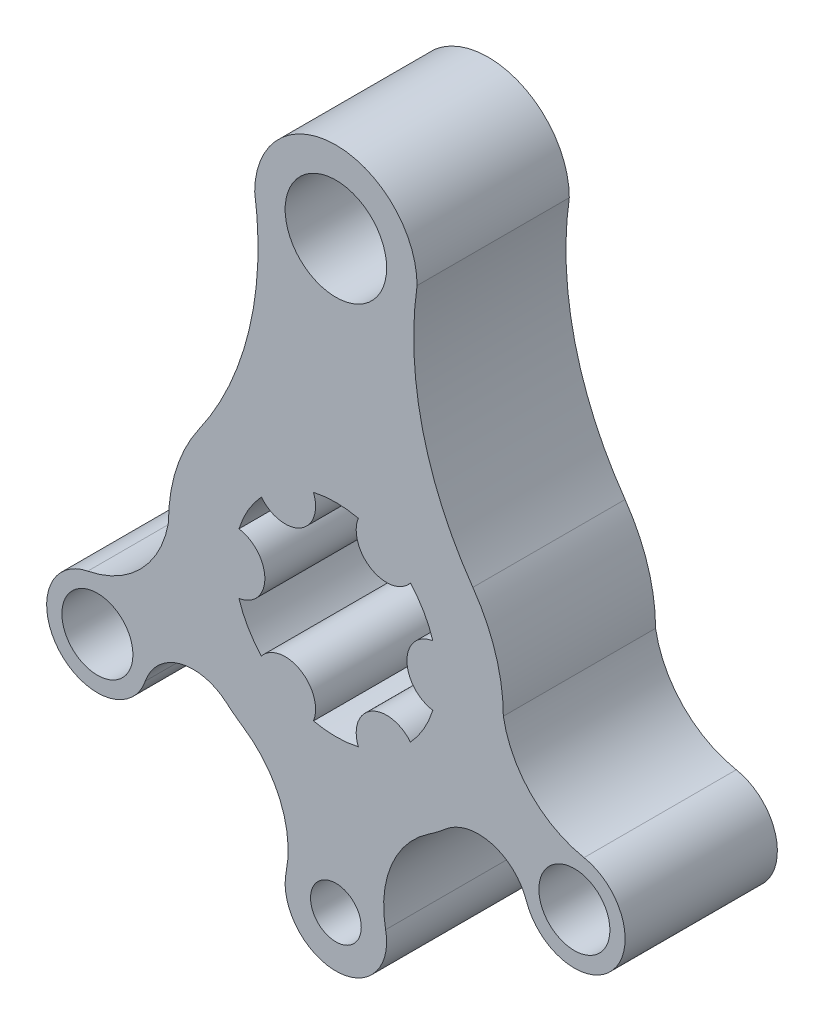
ISO-10303-21;
HEADER;
FILE_DESCRIPTION(('STEP AP214'),'2;1');
FILE_NAME('part.step','',(''),(''),'','','');
FILE_SCHEMA(('AUTOMOTIVE_DESIGN { 1 0 10303 214 1 1 1 1 }'));
ENDSEC;
DATA;
#1=APPLICATION_CONTEXT('core data for automotive mechanical design processes');
#2=APPLICATION_PROTOCOL_DEFINITION('international standard','automotive_design',2000,#1);
#3=PRODUCT_CONTEXT('',#1,'mechanical');
#4=PRODUCT('Part','Part','',(#3));
#5=PRODUCT_RELATED_PRODUCT_CATEGORY('part','',(#4));
#6=PRODUCT_DEFINITION_FORMATION('','',#4);
#7=PRODUCT_DEFINITION_CONTEXT('part definition',#1,'design');
#8=PRODUCT_DEFINITION('design','',#6,#7);
#9=PRODUCT_DEFINITION_SHAPE('','',#8);
#10=(LENGTH_UNIT() NAMED_UNIT(*) SI_UNIT(.MILLI.,.METRE.));
#11=(NAMED_UNIT(*) PLANE_ANGLE_UNIT() SI_UNIT($,.RADIAN.));
#12=(NAMED_UNIT(*) SI_UNIT($,.STERADIAN.) SOLID_ANGLE_UNIT());
#13=UNCERTAINTY_MEASURE_WITH_UNIT(LENGTH_MEASURE(1.E-05),#10,'distance_accuracy_value','');
#14=(GEOMETRIC_REPRESENTATION_CONTEXT(3) GLOBAL_UNCERTAINTY_ASSIGNED_CONTEXT((#13)) GLOBAL_UNIT_ASSIGNED_CONTEXT((#10,
#11,#12)) REPRESENTATION_CONTEXT('',''));
#15=CARTESIAN_POINT('',(0.,0.,0.));
#16=DIRECTION('',(0.,0.,1.));
#17=DIRECTION('',(1.,0.,0.));
#18=AXIS2_PLACEMENT_3D('',#15,#16,#17);
#19=CARTESIAN_POINT('',(52.6995581234815,3.4536082203362,15.));
#20=DIRECTION('',(0.,0.,-1.));
#21=DIRECTION('',(-1.,0.,0.));
#22=AXIS2_PLACEMENT_3D('',#19,#20,#21);
#23=CYLINDRICAL_SURFACE('',#22,20.);
#24=CARTESIAN_POINT('',(52.6995581234815,3.4536082203362,-15.));
#25=DIRECTION('',(0.,0.,1.));
#26=DIRECTION('',(1.,0.,0.));
#27=AXIS2_PLACEMENT_3D('',#24,#25,#26);
#28=CIRCLE('',#27,20.);
#29=CARTESIAN_POINT('',(33.,0.,-15.));
#30=VERTEX_POINT('',#29);
#31=CARTESIAN_POINT('',(48.8998527078272,-16.1821305932213,-15.));
#32=VERTEX_POINT('',#31);
#33=EDGE_CURVE('E305',#30,#32,#28,.T.);
#34=ORIENTED_EDGE('',*,*,#33,.F.);
#35=DIRECTION('',(0.,0.,-1.));
#36=VECTOR('',#35,1.);
#37=CARTESIAN_POINT('',(33.,0.,15.));
#38=LINE('',#37,#36);
#39=CARTESIAN_POINT('',(33.,0.,15.));
#40=VERTEX_POINT('',#39);
#41=EDGE_CURVE('E11',#40,#30,#38,.T.);
#42=ORIENTED_EDGE('',*,*,#41,.F.);
#43=CARTESIAN_POINT('',(52.6995581234815,3.4536082203362,15.));
#44=DIRECTION('',(0.,0.,1.));
#45=DIRECTION('',(1.,0.,0.));
#46=AXIS2_PLACEMENT_3D('',#43,#44,#45);
#47=CIRCLE('',#46,20.);
#48=CARTESIAN_POINT('',(48.8998527078272,-16.1821305932213,15.));
#49=VERTEX_POINT('',#48);
#50=EDGE_CURVE('E486',#40,#49,#47,.T.);
#51=ORIENTED_EDGE('',*,*,#50,.T.);
#52=DIRECTION('',(0.,0.,-1.));
#53=VECTOR('',#52,1.);
#54=CARTESIAN_POINT('',(48.8998527078272,-16.1821305932213,15.));
#55=LINE('',#54,#53);
#56=EDGE_CURVE('E150',#49,#32,#55,.T.);
#57=ORIENTED_EDGE('',*,*,#56,.T.);
#58=EDGE_LOOP('',(#34,#42,#51,#57));
#59=FACE_BOUND('',#58,.T.);
#60=ADVANCED_FACE('F37',(#59),#23,.F.);
#61=CARTESIAN_POINT('',(0.,0.,15.));
#62=DIRECTION('',(0.,0.,-1.));
#63=DIRECTION('',(-1.,0.,0.));
#64=AXIS2_PLACEMENT_3D('',#61,#62,#63);
#65=CYLINDRICAL_SURFACE('',#64,33.);
#66=CARTESIAN_POINT('',(0.,0.,-15.));
#67=DIRECTION('',(0.,0.,1.));
#68=DIRECTION('',(1.,0.,0.));
#69=AXIS2_PLACEMENT_3D('',#66,#67,#68);
#70=CIRCLE('',#69,33.);
#71=CARTESIAN_POINT('',(26.9908252272568,18.9867151859314,-15.));
#72=VERTEX_POINT('',#71);
#73=EDGE_CURVE('E308',#30,#72,#70,.T.);
#74=ORIENTED_EDGE('',*,*,#73,.T.);
#75=DIRECTION('',(0.,0.,-1.));
#76=VECTOR('',#75,1.);
#77=CARTESIAN_POINT('',(26.9908252272568,18.9867151859314,15.));
#78=LINE('',#77,#76);
#79=CARTESIAN_POINT('',(26.9908252272568,18.9867151859314,15.));
#80=VERTEX_POINT('',#79);
#81=EDGE_CURVE('E47',#80,#72,#78,.T.);
#82=ORIENTED_EDGE('',*,*,#81,.F.);
#83=CARTESIAN_POINT('',(0.,0.,15.));
#84=DIRECTION('',(0.,0.,1.));
#85=DIRECTION('',(1.,0.,0.));
#86=AXIS2_PLACEMENT_3D('',#83,#84,#85);
#87=CIRCLE('',#86,33.);
#88=EDGE_CURVE('E488',#40,#80,#87,.T.);
#89=ORIENTED_EDGE('',*,*,#88,.F.);
#90=ORIENTED_EDGE('',*,*,#41,.T.);
#91=EDGE_LOOP('',(#74,#82,#89,#90));
#92=FACE_BOUND('',#91,.T.);
#93=ADVANCED_FACE('F528',(#92),#65,.T.);
#94=CARTESIAN_POINT('',(79.3366680922397,55.8094355465256,15.));
#95=DIRECTION('',(0.,0.,-1.));
#96=DIRECTION('',(-1.,0.,0.));
#97=AXIS2_PLACEMENT_3D('',#94,#95,#96);
#98=CYLINDRICAL_SURFACE('',#97,64.);
#99=CARTESIAN_POINT('',(79.3366680922397,55.8094355465256,-15.));
#100=DIRECTION('',(0.,0.,1.));
#101=DIRECTION('',(1.,0.,0.));
#102=AXIS2_PLACEMENT_3D('',#99,#100,#101);
#103=CIRCLE('',#102,64.);
#104=CARTESIAN_POINT('',(16.,65.0000000000001,-15.));
#105=VERTEX_POINT('',#104);
#106=EDGE_CURVE('E311',#105,#72,#103,.T.);
#107=ORIENTED_EDGE('',*,*,#106,.F.);
#108=DIRECTION('',(0.,0.,-1.));
#109=VECTOR('',#108,1.);
#110=CARTESIAN_POINT('',(16.,65.0000000000001,15.));
#111=LINE('',#110,#109);
#112=CARTESIAN_POINT('',(16.,65.0000000000001,15.));
#113=VERTEX_POINT('',#112);
#114=EDGE_CURVE('E379',#113,#105,#111,.T.);
#115=ORIENTED_EDGE('',*,*,#114,.F.);
#116=CARTESIAN_POINT('',(79.3366680922397,55.8094355465256,15.));
#117=DIRECTION('',(0.,0.,1.));
#118=DIRECTION('',(1.,0.,0.));
#119=AXIS2_PLACEMENT_3D('',#116,#117,#118);
#120=CIRCLE('',#119,64.);
#121=EDGE_CURVE('E490',#113,#80,#120,.T.);
#122=ORIENTED_EDGE('',*,*,#121,.T.);
#123=ORIENTED_EDGE('',*,*,#81,.T.);
#124=EDGE_LOOP('',(#107,#115,#122,#123));
#125=FACE_BOUND('',#124,.T.);
#126=ADVANCED_FACE('F531',(#125),#98,.F.);
#127=CARTESIAN_POINT('',(0.,65.,15.));
#128=DIRECTION('',(0.,0.,-1.));
#129=DIRECTION('',(-1.,0.,0.));
#130=AXIS2_PLACEMENT_3D('',#127,#128,#129);
#131=CYLINDRICAL_SURFACE('',#130,16.);
#132=CARTESIAN_POINT('',(0.,65.,-15.));
#133=DIRECTION('',(0.,0.,1.));
#134=DIRECTION('',(1.,0.,0.));
#135=AXIS2_PLACEMENT_3D('',#132,#133,#134);
#136=CIRCLE('',#135,16.);
#137=CARTESIAN_POINT('',(-16.,65.0000000000001,-15.));
#138=VERTEX_POINT('',#137);
#139=EDGE_CURVE('E314',#105,#138,#136,.T.);
#140=ORIENTED_EDGE('',*,*,#139,.T.);
#141=DIRECTION('',(0.,0.,-1.));
#142=VECTOR('',#141,1.);
#143=CARTESIAN_POINT('',(-16.,65.0000000000001,15.));
#144=LINE('',#143,#142);
#145=CARTESIAN_POINT('',(-16.,65.0000000000001,15.));
#146=VERTEX_POINT('',#145);
#147=EDGE_CURVE('E376',#146,#138,#144,.T.);
#148=ORIENTED_EDGE('',*,*,#147,.F.);
#149=CARTESIAN_POINT('',(0.,65.,15.));
#150=DIRECTION('',(0.,0.,1.));
#151=DIRECTION('',(1.,0.,0.));
#152=AXIS2_PLACEMENT_3D('',#149,#150,#151);
#153=CIRCLE('',#152,16.);
#154=EDGE_CURVE('E493',#113,#146,#153,.T.);
#155=ORIENTED_EDGE('',*,*,#154,.F.);
#156=ORIENTED_EDGE('',*,*,#114,.T.);
#157=EDGE_LOOP('',(#140,#148,#155,#156));
#158=FACE_BOUND('',#157,.T.);
#159=ADVANCED_FACE('F536',(#158),#131,.T.);
#160=CARTESIAN_POINT('',(-79.3366680922397,55.8094355465256,15.));
#161=DIRECTION('',(0.,0.,-1.));
#162=DIRECTION('',(-1.,0.,0.));
#163=AXIS2_PLACEMENT_3D('',#160,#161,#162);
#164=CYLINDRICAL_SURFACE('',#163,64.);
#165=CARTESIAN_POINT('',(-79.3366680922397,55.8094355465256,-15.));
#166=DIRECTION('',(0.,0.,1.));
#167=DIRECTION('',(1.,0.,0.));
#168=AXIS2_PLACEMENT_3D('',#165,#166,#167);
#169=CIRCLE('',#168,64.);
#170=CARTESIAN_POINT('',(-26.9908252272568,18.9867151859314,-15.));
#171=VERTEX_POINT('',#170);
#172=EDGE_CURVE('E317',#138,#171,#169,.F.);
#173=ORIENTED_EDGE('',*,*,#172,.T.);
#174=DIRECTION('',(0.,0.,-1.));
#175=VECTOR('',#174,1.);
#176=CARTESIAN_POINT('',(-26.9908252272568,18.9867151859314,15.));
#177=LINE('',#176,#175);
#178=CARTESIAN_POINT('',(-26.9908252272568,18.9867151859314,15.));
#179=VERTEX_POINT('',#178);
#180=EDGE_CURVE('E373',#179,#171,#177,.T.);
#181=ORIENTED_EDGE('',*,*,#180,.F.);
#182=CARTESIAN_POINT('',(-79.3366680922397,55.8094355465256,15.));
#183=DIRECTION('',(0.,0.,1.));
#184=DIRECTION('',(1.,0.,0.));
#185=AXIS2_PLACEMENT_3D('',#182,#183,#184);
#186=CIRCLE('',#185,64.);
#187=EDGE_CURVE('E496',#146,#179,#186,.F.);
#188=ORIENTED_EDGE('',*,*,#187,.F.);
#189=ORIENTED_EDGE('',*,*,#147,.T.);
#190=EDGE_LOOP('',(#173,#181,#188,#189));
#191=FACE_BOUND('',#190,.T.);
#192=ADVANCED_FACE('F540',(#191),#164,.F.);
#193=CARTESIAN_POINT('',(0.,0.,15.));
#194=DIRECTION('',(0.,0.,-1.));
#195=DIRECTION('',(-1.,0.,0.));
#196=AXIS2_PLACEMENT_3D('',#193,#194,#195);
#197=CYLINDRICAL_SURFACE('',#196,33.);
#198=CARTESIAN_POINT('',(0.,0.,-15.));
#199=DIRECTION('',(0.,0.,1.));
#200=DIRECTION('',(1.,0.,0.));
#201=AXIS2_PLACEMENT_3D('',#198,#199,#200);
#202=CIRCLE('',#201,33.);
#203=CARTESIAN_POINT('',(-33.,0.,-15.));
#204=VERTEX_POINT('',#203);
#205=EDGE_CURVE('E320',#171,#204,#202,.T.);
#206=ORIENTED_EDGE('',*,*,#205,.T.);
#207=DIRECTION('',(0.,0.,-1.));
#208=VECTOR('',#207,1.);
#209=CARTESIAN_POINT('',(-33.,0.,15.));
#210=LINE('',#209,#208);
#211=CARTESIAN_POINT('',(-33.,0.,15.));
#212=VERTEX_POINT('',#211);
#213=EDGE_CURVE('E370',#212,#204,#210,.T.);
#214=ORIENTED_EDGE('',*,*,#213,.F.);
#215=CARTESIAN_POINT('',(0.,0.,15.));
#216=DIRECTION('',(0.,0.,1.));
#217=DIRECTION('',(1.,0.,0.));
#218=AXIS2_PLACEMENT_3D('',#215,#216,#217);
#219=CIRCLE('',#218,33.);
#220=EDGE_CURVE('E499',#179,#212,#219,.T.);
#221=ORIENTED_EDGE('',*,*,#220,.F.);
#222=ORIENTED_EDGE('',*,*,#180,.T.);
#223=EDGE_LOOP('',(#206,#214,#221,#222));
#224=FACE_BOUND('',#223,.T.);
#225=ADVANCED_FACE('F542',(#224),#197,.T.);
#226=CARTESIAN_POINT('',(-52.6995581234815,3.4536082203362,15.));
#227=DIRECTION('',(0.,0.,-1.));
#228=DIRECTION('',(-1.,0.,0.));
#229=AXIS2_PLACEMENT_3D('',#226,#227,#228);
#230=CYLINDRICAL_SURFACE('',#229,20.);
#231=CARTESIAN_POINT('',(-52.6995581234815,3.4536082203362,-15.));
#232=DIRECTION('',(0.,0.,1.));
#233=DIRECTION('',(1.,0.,0.));
#234=AXIS2_PLACEMENT_3D('',#231,#232,#233);
#235=CIRCLE('',#234,20.);
#236=CARTESIAN_POINT('',(-48.8998527078272,-16.1821305932213,-15.));
#237=VERTEX_POINT('',#236);
#238=EDGE_CURVE('E323',#204,#237,#235,.F.);
#239=ORIENTED_EDGE('',*,*,#238,.T.);
#240=DIRECTION('',(0.,0.,-1.));
#241=VECTOR('',#240,1.);
#242=CARTESIAN_POINT('',(-48.8998527078272,-16.1821305932213,15.));
#243=LINE('',#242,#241);
#244=CARTESIAN_POINT('',(-48.8998527078272,-16.1821305932213,15.));
#245=VERTEX_POINT('',#244);
#246=EDGE_CURVE('E367',#245,#237,#243,.T.);
#247=ORIENTED_EDGE('',*,*,#246,.F.);
#248=CARTESIAN_POINT('',(-52.6995581234815,3.4536082203362,15.));
#249=DIRECTION('',(0.,0.,1.));
#250=DIRECTION('',(1.,0.,0.));
#251=AXIS2_PLACEMENT_3D('',#248,#249,#250);
#252=CIRCLE('',#251,20.);
#253=EDGE_CURVE('E502',#212,#245,#252,.F.);
#254=ORIENTED_EDGE('',*,*,#253,.F.);
#255=ORIENTED_EDGE('',*,*,#213,.T.);
#256=EDGE_LOOP('',(#239,#247,#254,#255));
#257=FACE_BOUND('',#256,.T.);
#258=ADVANCED_FACE('F544',(#257),#230,.F.);
#259=CARTESIAN_POINT('',(-47.,-26.,15.));
#260=DIRECTION('',(0.,0.,-1.));
#261=DIRECTION('',(-1.,0.,0.));
#262=AXIS2_PLACEMENT_3D('',#259,#260,#261);
#263=CYLINDRICAL_SURFACE('',#262,9.99999999999999);
#264=CARTESIAN_POINT('',(-47.,-26.,-15.));
#265=DIRECTION('',(0.,0.,1.));
#266=DIRECTION('',(1.,0.,0.));
#267=AXIS2_PLACEMENT_3D('',#264,#265,#266);
#268=CIRCLE('',#267,9.99999999999999);
#269=CARTESIAN_POINT('',(-37.5509150364807,-29.2733458955926,-15.));
#270=VERTEX_POINT('',#269);
#271=EDGE_CURVE('E326',#237,#270,#268,.T.);
#272=ORIENTED_EDGE('',*,*,#271,.T.);
#273=DIRECTION('',(0.,0.,-1.));
#274=VECTOR('',#273,1.);
#275=CARTESIAN_POINT('',(-37.5509150364807,-29.2733458955926,15.));
#276=LINE('',#275,#274);
#277=CARTESIAN_POINT('',(-37.5509150364807,-29.2733458955926,15.));
#278=VERTEX_POINT('',#277);
#279=EDGE_CURVE('E364',#278,#270,#276,.T.);
#280=ORIENTED_EDGE('',*,*,#279,.F.);
#281=CARTESIAN_POINT('',(-47.,-26.,15.));
#282=DIRECTION('',(0.,0.,1.));
#283=DIRECTION('',(1.,0.,0.));
#284=AXIS2_PLACEMENT_3D('',#281,#282,#283);
#285=CIRCLE('',#284,9.99999999999999);
#286=EDGE_CURVE('E505',#245,#278,#285,.T.);
#287=ORIENTED_EDGE('',*,*,#286,.F.);
#288=ORIENTED_EDGE('',*,*,#246,.T.);
#289=EDGE_LOOP('',(#272,#280,#287,#288));
#290=FACE_BOUND('',#289,.T.);
#291=ADVANCED_FACE('F549',(#290),#263,.T.);
#292=CARTESIAN_POINT('',(-28.1018300729614,-32.5466917911852,15.));
#293=DIRECTION('',(0.,0.,-1.));
#294=DIRECTION('',(-1.,0.,0.));
#295=AXIS2_PLACEMENT_3D('',#292,#293,#294);
#296=CYLINDRICAL_SURFACE('',#295,10.);
#297=CARTESIAN_POINT('',(-28.1018300729614,-32.5466917911852,-15.));
#298=DIRECTION('',(0.,0.,1.));
#299=DIRECTION('',(1.,0.,0.));
#300=AXIS2_PLACEMENT_3D('',#297,#298,#299);
#301=CIRCLE('',#300,10.);
#302=CARTESIAN_POINT('',(-21.566520753668,-24.9776937002119,-15.));
#303=VERTEX_POINT('',#302);
#304=EDGE_CURVE('E329',#270,#303,#301,.F.);
#305=ORIENTED_EDGE('',*,*,#304,.T.);
#306=DIRECTION('',(0.,0.,-1.));
#307=VECTOR('',#306,1.);
#308=CARTESIAN_POINT('',(-21.566520753668,-24.9776937002119,15.));
#309=LINE('',#308,#307);
#310=CARTESIAN_POINT('',(-21.566520753668,-24.9776937002119,15.));
#311=VERTEX_POINT('',#310);
#312=EDGE_CURVE('E361',#311,#303,#309,.T.);
#313=ORIENTED_EDGE('',*,*,#312,.F.);
#314=CARTESIAN_POINT('',(-28.1018300729614,-32.5466917911852,15.));
#315=DIRECTION('',(0.,0.,1.));
#316=DIRECTION('',(1.,0.,0.));
#317=AXIS2_PLACEMENT_3D('',#314,#315,#316);
#318=CIRCLE('',#317,10.);
#319=EDGE_CURVE('E508',#278,#311,#318,.F.);
#320=ORIENTED_EDGE('',*,*,#319,.F.);
#321=ORIENTED_EDGE('',*,*,#279,.T.);
#322=EDGE_LOOP('',(#305,#313,#320,#321));
#323=FACE_BOUND('',#322,.T.);
#324=ADVANCED_FACE('F551',(#323),#296,.F.);
#325=CARTESIAN_POINT('',(0.,0.,15.));
#326=DIRECTION('',(0.,0.,-1.));
#327=DIRECTION('',(-1.,0.,0.));
#328=AXIS2_PLACEMENT_3D('',#325,#326,#327);
#329=CYLINDRICAL_SURFACE('',#328,33.);
#330=CARTESIAN_POINT('',(0.,0.,-15.));
#331=DIRECTION('',(0.,0.,1.));
#332=DIRECTION('',(1.,0.,0.));
#333=AXIS2_PLACEMENT_3D('',#330,#331,#332);
#334=CIRCLE('',#333,33.);
#335=CARTESIAN_POINT('',(-18.3131972355137,-27.4522641509434,-15.));
#336=VERTEX_POINT('',#335);
#337=EDGE_CURVE('E332',#303,#336,#334,.T.);
#338=ORIENTED_EDGE('',*,*,#337,.T.);
#339=DIRECTION('',(0.,0.,-1.));
#340=VECTOR('',#339,1.);
#341=CARTESIAN_POINT('',(-18.3131972355137,-27.4522641509434,15.));
#342=LINE('',#341,#340);
#343=CARTESIAN_POINT('',(-18.3131972355137,-27.4522641509434,15.));
#344=VERTEX_POINT('',#343);
#345=EDGE_CURVE('E358',#344,#336,#342,.T.);
#346=ORIENTED_EDGE('',*,*,#345,.F.);
#347=CARTESIAN_POINT('',(0.,0.,15.));
#348=DIRECTION('',(0.,0.,1.));
#349=DIRECTION('',(1.,0.,0.));
#350=AXIS2_PLACEMENT_3D('',#347,#348,#349);
#351=CIRCLE('',#350,33.);
#352=EDGE_CURVE('E511',#311,#344,#351,.T.);
#353=ORIENTED_EDGE('',*,*,#352,.F.);
#354=ORIENTED_EDGE('',*,*,#312,.T.);
#355=EDGE_LOOP('',(#338,#346,#353,#354));
#356=FACE_BOUND('',#355,.T.);
#357=ADVANCED_FACE('F553',(#356),#329,.T.);
#358=CARTESIAN_POINT('',(-29.4121046509766,-44.09,15.));
#359=DIRECTION('',(0.,0.,-1.));
#360=DIRECTION('',(-1.,0.,0.));
#361=AXIS2_PLACEMENT_3D('',#358,#359,#360);
#362=CYLINDRICAL_SURFACE('',#361,20.);
#363=CARTESIAN_POINT('',(-29.4121046509766,-44.09,-15.));
#364=DIRECTION('',(0.,0.,1.));
#365=DIRECTION('',(1.,0.,0.));
#366=AXIS2_PLACEMENT_3D('',#363,#364,#365);
#367=CIRCLE('',#366,20.);
#368=CARTESIAN_POINT('',(-9.80403488365886,-48.03,-15.));
#369=VERTEX_POINT('',#368);
#370=EDGE_CURVE('E335',#336,#369,#367,.F.);
#371=ORIENTED_EDGE('',*,*,#370,.T.);
#372=DIRECTION('',(0.,0.,-1.));
#373=VECTOR('',#372,1.);
#374=CARTESIAN_POINT('',(-9.80403488365886,-48.03,15.));
#375=LINE('',#374,#373);
#376=CARTESIAN_POINT('',(-9.80403488365886,-48.03,15.));
#377=VERTEX_POINT('',#376);
#378=EDGE_CURVE('E355',#377,#369,#375,.T.);
#379=ORIENTED_EDGE('',*,*,#378,.F.);
#380=CARTESIAN_POINT('',(-29.4121046509766,-44.09,15.));
#381=DIRECTION('',(0.,0.,1.));
#382=DIRECTION('',(1.,0.,0.));
#383=AXIS2_PLACEMENT_3D('',#380,#381,#382);
#384=CIRCLE('',#383,20.);
#385=EDGE_CURVE('E514',#344,#377,#384,.F.);
#386=ORIENTED_EDGE('',*,*,#385,.F.);
#387=ORIENTED_EDGE('',*,*,#345,.T.);
#388=EDGE_LOOP('',(#371,#379,#386,#387));
#389=FACE_BOUND('',#388,.T.);
#390=ADVANCED_FACE('F557',(#389),#362,.F.);
#391=CARTESIAN_POINT('',(0.,-50.,15.));
#392=DIRECTION('',(0.,0.,-1.));
#393=DIRECTION('',(-1.,0.,0.));
#394=AXIS2_PLACEMENT_3D('',#391,#392,#393);
#395=CYLINDRICAL_SURFACE('',#394,9.99999999999999);
#396=CARTESIAN_POINT('',(0.,-50.,-15.));
#397=DIRECTION('',(0.,0.,1.));
#398=DIRECTION('',(1.,0.,0.));
#399=AXIS2_PLACEMENT_3D('',#396,#397,#398);
#400=CIRCLE('',#399,9.99999999999999);
#401=CARTESIAN_POINT('',(9.80403488365886,-48.03,-15.));
#402=VERTEX_POINT('',#401);
#403=EDGE_CURVE('E338',#369,#402,#400,.T.);
#404=ORIENTED_EDGE('',*,*,#403,.T.);
#405=DIRECTION('',(0.,0.,-1.));
#406=VECTOR('',#405,1.);
#407=CARTESIAN_POINT('',(9.80403488365886,-48.03,15.));
#408=LINE('',#407,#406);
#409=CARTESIAN_POINT('',(9.80403488365886,-48.03,15.));
#410=VERTEX_POINT('',#409);
#411=EDGE_CURVE('E353',#410,#402,#408,.T.);
#412=ORIENTED_EDGE('',*,*,#411,.F.);
#413=CARTESIAN_POINT('',(0.,-50.,15.));
#414=DIRECTION('',(0.,0.,1.));
#415=DIRECTION('',(1.,0.,0.));
#416=AXIS2_PLACEMENT_3D('',#413,#414,#415);
#417=CIRCLE('',#416,9.99999999999999);
#418=EDGE_CURVE('E517',#377,#410,#417,.T.);
#419=ORIENTED_EDGE('',*,*,#418,.F.);
#420=ORIENTED_EDGE('',*,*,#378,.T.);
#421=EDGE_LOOP('',(#404,#412,#419,#420));
#422=FACE_BOUND('',#421,.T.);
#423=ADVANCED_FACE('F559',(#422),#395,.T.);
#424=CARTESIAN_POINT('',(29.4121046509766,-44.09,15.));
#425=DIRECTION('',(0.,0.,-1.));
#426=DIRECTION('',(-1.,0.,0.));
#427=AXIS2_PLACEMENT_3D('',#424,#425,#426);
#428=CYLINDRICAL_SURFACE('',#427,20.);
#429=CARTESIAN_POINT('',(29.4121046509766,-44.09,-15.));
#430=DIRECTION('',(0.,0.,1.));
#431=DIRECTION('',(1.,0.,0.));
#432=AXIS2_PLACEMENT_3D('',#429,#430,#431);
#433=CIRCLE('',#432,20.);
#434=CARTESIAN_POINT('',(18.3131972355137,-27.4522641509434,-15.));
#435=VERTEX_POINT('',#434);
#436=EDGE_CURVE('E341',#435,#402,#433,.T.);
#437=ORIENTED_EDGE('',*,*,#436,.F.);
#438=DIRECTION('',(0.,0.,-1.));
#439=VECTOR('',#438,1.);
#440=CARTESIAN_POINT('',(18.3131972355137,-27.4522641509434,15.));
#441=LINE('',#440,#439);
#442=CARTESIAN_POINT('',(18.3131972355137,-27.4522641509434,15.));
#443=VERTEX_POINT('',#442);
#444=EDGE_CURVE('E249',#443,#435,#441,.T.);
#445=ORIENTED_EDGE('',*,*,#444,.F.);
#446=CARTESIAN_POINT('',(29.4121046509766,-44.09,15.));
#447=DIRECTION('',(0.,0.,1.));
#448=DIRECTION('',(1.,0.,0.));
#449=AXIS2_PLACEMENT_3D('',#446,#447,#448);
#450=CIRCLE('',#449,20.);
#451=EDGE_CURVE('E238',#443,#410,#450,.T.);
#452=ORIENTED_EDGE('',*,*,#451,.T.);
#453=ORIENTED_EDGE('',*,*,#411,.T.);
#454=EDGE_LOOP('',(#437,#445,#452,#453));
#455=FACE_BOUND('',#454,.T.);
#456=ADVANCED_FACE('F520',(#455),#428,.F.);
#457=CARTESIAN_POINT('',(0.,0.,15.));
#458=DIRECTION('',(0.,0.,-1.));
#459=DIRECTION('',(-1.,0.,0.));
#460=AXIS2_PLACEMENT_3D('',#457,#458,#459);
#461=CYLINDRICAL_SURFACE('',#460,33.);
#462=CARTESIAN_POINT('',(0.,0.,-15.));
#463=DIRECTION('',(0.,0.,1.));
#464=DIRECTION('',(1.,0.,0.));
#465=AXIS2_PLACEMENT_3D('',#462,#463,#464);
#466=CIRCLE('',#465,33.);
#467=CARTESIAN_POINT('',(21.566520753668,-24.9776937002119,-15.));
#468=VERTEX_POINT('',#467);
#469=EDGE_CURVE('E245',#435,#468,#466,.T.);
#470=ORIENTED_EDGE('',*,*,#469,.T.);
#471=DIRECTION('',(0.,0.,-1.));
#472=VECTOR('',#471,1.);
#473=CARTESIAN_POINT('',(21.566520753668,-24.9776937002119,15.));
#474=LINE('',#473,#472);
#475=CARTESIAN_POINT('',(21.566520753668,-24.9776937002119,15.));
#476=VERTEX_POINT('',#475);
#477=EDGE_CURVE('E242',#476,#468,#474,.T.);
#478=ORIENTED_EDGE('',*,*,#477,.F.);
#479=CARTESIAN_POINT('',(0.,0.,15.));
#480=DIRECTION('',(0.,0.,1.));
#481=DIRECTION('',(1.,0.,0.));
#482=AXIS2_PLACEMENT_3D('',#479,#480,#481);
#483=CIRCLE('',#482,33.);
#484=EDGE_CURVE('E232',#443,#476,#483,.T.);
#485=ORIENTED_EDGE('',*,*,#484,.F.);
#486=ORIENTED_EDGE('',*,*,#444,.T.);
#487=EDGE_LOOP('',(#470,#478,#485,#486));
#488=FACE_BOUND('',#487,.T.);
#489=ADVANCED_FACE('F243',(#488),#461,.T.);
#490=CARTESIAN_POINT('',(28.1018300729614,-32.5466917911852,15.));
#491=DIRECTION('',(0.,0.,-1.));
#492=DIRECTION('',(-1.,0.,0.));
#493=AXIS2_PLACEMENT_3D('',#490,#491,#492);
#494=CYLINDRICAL_SURFACE('',#493,10.);
#495=CARTESIAN_POINT('',(28.1018300729614,-32.5466917911852,-15.));
#496=DIRECTION('',(0.,0.,1.));
#497=DIRECTION('',(1.,0.,0.));
#498=AXIS2_PLACEMENT_3D('',#495,#496,#497);
#499=CIRCLE('',#498,10.);
#500=CARTESIAN_POINT('',(37.5509150364807,-29.2733458955926,-15.));
#501=VERTEX_POINT('',#500);
#502=EDGE_CURVE('E345',#501,#468,#499,.T.);
#503=ORIENTED_EDGE('',*,*,#502,.F.);
#504=DIRECTION('',(0.,0.,-1.));
#505=VECTOR('',#504,1.);
#506=CARTESIAN_POINT('',(37.5509150364807,-29.2733458955926,15.));
#507=LINE('',#506,#505);
#508=CARTESIAN_POINT('',(37.5509150364807,-29.2733458955926,15.));
#509=VERTEX_POINT('',#508);
#510=EDGE_CURVE('E143',#509,#501,#507,.T.);
#511=ORIENTED_EDGE('',*,*,#510,.F.);
#512=CARTESIAN_POINT('',(28.1018300729614,-32.5466917911852,15.));
#513=DIRECTION('',(0.,0.,1.));
#514=DIRECTION('',(1.,0.,0.));
#515=AXIS2_PLACEMENT_3D('',#512,#513,#514);
#516=CIRCLE('',#515,10.);
#517=EDGE_CURVE('E236',#509,#476,#516,.T.);
#518=ORIENTED_EDGE('',*,*,#517,.T.);
#519=ORIENTED_EDGE('',*,*,#477,.T.);
#520=EDGE_LOOP('',(#503,#511,#518,#519));
#521=FACE_BOUND('',#520,.T.);
#522=ADVANCED_FACE('F251',(#521),#494,.F.);
#523=CARTESIAN_POINT('',(0.,0.,15.));
#524=DIRECTION('',(0.,0.,-1.));
#525=DIRECTION('',(-1.,0.,0.));
#526=AXIS2_PLACEMENT_3D('',#523,#524,#525);
#527=CYLINDRICAL_SURFACE('',#526,20.);
#528=CARTESIAN_POINT('',(0.,0.,-15.));
#529=DIRECTION('',(0.,0.,1.));
#530=DIRECTION('',(1.,0.,0.));
#531=AXIS2_PLACEMENT_3D('',#528,#529,#530);
#532=CIRCLE('',#531,20.);
#533=CARTESIAN_POINT('',(19.1,5.93211597998555,-15.));
#534=VERTEX_POINT('',#533);
#535=CARTESIAN_POINT('',(14.6873631368633,13.5750272222898,-15.));
#536=VERTEX_POINT('',#535);
#537=EDGE_CURVE('E269',#534,#536,#532,.T.);
#538=ORIENTED_EDGE('',*,*,#537,.F.);
#539=DIRECTION('',(0.,0.,-1.));
#540=VECTOR('',#539,1.);
#541=CARTESIAN_POINT('',(19.1,5.93211597998555,15.));
#542=LINE('',#541,#540);
#543=CARTESIAN_POINT('',(19.1,5.93211597998555,15.));
#544=VERTEX_POINT('',#543);
#545=EDGE_CURVE('E41',#544,#534,#542,.T.);
#546=ORIENTED_EDGE('',*,*,#545,.F.);
#547=CARTESIAN_POINT('',(0.,0.,15.));
#548=DIRECTION('',(0.,0.,1.));
#549=DIRECTION('',(1.,0.,0.));
#550=AXIS2_PLACEMENT_3D('',#547,#548,#549);
#551=CIRCLE('',#550,20.);
#552=CARTESIAN_POINT('',(14.6873631368633,13.5750272222898,15.));
#553=VERTEX_POINT('',#552);
#554=EDGE_CURVE('E417',#544,#553,#551,.T.);
#555=ORIENTED_EDGE('',*,*,#554,.T.);
#556=DIRECTION('',(0.,0.,-1.));
#557=VECTOR('',#556,1.);
#558=CARTESIAN_POINT('',(14.6873631368633,13.5750272222898,15.));
#559=LINE('',#558,#557);
#560=EDGE_CURVE('E253',#553,#536,#559,.T.);
#561=ORIENTED_EDGE('',*,*,#560,.T.);
#562=EDGE_LOOP('',(#538,#546,#555,#561));
#563=FACE_BOUND('',#562,.T.);
#564=ADVANCED_FACE('F415',(#563),#527,.F.);
#565=CARTESIAN_POINT('',(20.,0.,15.));
#566=DIRECTION('',(0.,0.,-1.));
#567=DIRECTION('',(-1.,0.,0.));
#568=AXIS2_PLACEMENT_3D('',#565,#566,#567);
#569=CYLINDRICAL_SURFACE('',#568,5.99999999999999);
#570=CARTESIAN_POINT('',(20.,0.,-15.));
#571=DIRECTION('',(0.,0.,1.));
#572=DIRECTION('',(1.,0.,0.));
#573=AXIS2_PLACEMENT_3D('',#570,#571,#572);
#574=CIRCLE('',#573,5.99999999999999);
#575=CARTESIAN_POINT('',(19.1,-5.93211597998556,-15.));
#576=VERTEX_POINT('',#575);
#577=EDGE_CURVE('E272',#534,#576,#574,.T.);
#578=ORIENTED_EDGE('',*,*,#577,.T.);
#579=DIRECTION('',(0.,0.,-1.));
#580=VECTOR('',#579,1.);
#581=CARTESIAN_POINT('',(19.1,-5.93211597998556,15.));
#582=LINE('',#581,#580);
#583=CARTESIAN_POINT('',(19.1,-5.93211597998556,15.));
#584=VERTEX_POINT('',#583);
#585=EDGE_CURVE('E400',#584,#576,#582,.T.);
#586=ORIENTED_EDGE('',*,*,#585,.F.);
#587=CARTESIAN_POINT('',(20.,0.,15.));
#588=DIRECTION('',(0.,0.,1.));
#589=DIRECTION('',(1.,0.,0.));
#590=AXIS2_PLACEMENT_3D('',#587,#588,#589);
#591=CIRCLE('',#590,5.99999999999999);
#592=EDGE_CURVE('E408',#544,#584,#591,.T.);
#593=ORIENTED_EDGE('',*,*,#592,.F.);
#594=ORIENTED_EDGE('',*,*,#545,.T.);
#595=EDGE_LOOP('',(#578,#586,#593,#594));
#596=FACE_BOUND('',#595,.T.);
#597=ADVANCED_FACE('F407',(#596),#569,.T.);
#598=CARTESIAN_POINT('',(0.,0.,15.));
#599=DIRECTION('',(0.,0.,-1.));
#600=DIRECTION('',(-1.,0.,0.));
#601=AXIS2_PLACEMENT_3D('',#598,#599,#600);
#602=CYLINDRICAL_SURFACE('',#601,20.);
#603=CARTESIAN_POINT('',(0.,0.,-15.));
#604=DIRECTION('',(0.,0.,1.));
#605=DIRECTION('',(1.,0.,0.));
#606=AXIS2_PLACEMENT_3D('',#603,#604,#605);
#607=CIRCLE('',#606,20.);
#608=CARTESIAN_POINT('',(14.6873631368631,-13.57502722229,-15.));
#609=VERTEX_POINT('',#608);
#610=EDGE_CURVE('E275',#609,#576,#607,.T.);
#611=ORIENTED_EDGE('',*,*,#610,.F.);
#612=DIRECTION('',(0.,0.,-1.));
#613=VECTOR('',#612,1.);
#614=CARTESIAN_POINT('',(14.6873631368631,-13.57502722229,15.));
#615=LINE('',#614,#613);
#616=CARTESIAN_POINT('',(14.6873631368631,-13.57502722229,15.));
#617=VERTEX_POINT('',#616);
#618=EDGE_CURVE('E399',#617,#609,#615,.T.);
#619=ORIENTED_EDGE('',*,*,#618,.F.);
#620=CARTESIAN_POINT('',(0.,0.,15.));
#621=DIRECTION('',(0.,0.,1.));
#622=DIRECTION('',(1.,0.,0.));
#623=AXIS2_PLACEMENT_3D('',#620,#621,#622);
#624=CIRCLE('',#623,20.);
#625=EDGE_CURVE('E466',#617,#584,#624,.T.);
#626=ORIENTED_EDGE('',*,*,#625,.T.);
#627=ORIENTED_EDGE('',*,*,#585,.T.);
#628=EDGE_LOOP('',(#611,#619,#626,#627));
#629=FACE_BOUND('',#628,.T.);
#630=ADVANCED_FACE('F464',(#629),#602,.F.);
#631=CARTESIAN_POINT('',(9.99999999999996,-17.3205080756888,15.));
#632=DIRECTION('',(0.,0.,-1.));
#633=DIRECTION('',(-1.,0.,0.));
#634=AXIS2_PLACEMENT_3D('',#631,#632,#633);
#635=CYLINDRICAL_SURFACE('',#634,5.99999999999999);
#636=CARTESIAN_POINT('',(9.99999999999996,-17.3205080756888,-15.));
#637=DIRECTION('',(0.,0.,1.));
#638=DIRECTION('',(1.,0.,0.));
#639=AXIS2_PLACEMENT_3D('',#636,#637,#638);
#640=CIRCLE('',#639,5.99999999999999);
#641=CARTESIAN_POINT('',(4.41263686313685,-19.5071432022756,-15.));
#642=VERTEX_POINT('',#641);
#643=EDGE_CURVE('E278',#609,#642,#640,.T.);
#644=ORIENTED_EDGE('',*,*,#643,.T.);
#645=DIRECTION('',(0.,0.,-1.));
#646=VECTOR('',#645,1.);
#647=CARTESIAN_POINT('',(4.41263686313685,-19.5071432022756,15.));
#648=LINE('',#647,#646);
#649=CARTESIAN_POINT('',(4.41263686313685,-19.5071432022756,15.));
#650=VERTEX_POINT('',#649);
#651=EDGE_CURVE('E397',#650,#642,#648,.T.);
#652=ORIENTED_EDGE('',*,*,#651,.F.);
#653=CARTESIAN_POINT('',(9.99999999999996,-17.3205080756888,15.));
#654=DIRECTION('',(0.,0.,1.));
#655=DIRECTION('',(1.,0.,0.));
#656=AXIS2_PLACEMENT_3D('',#653,#654,#655);
#657=CIRCLE('',#656,5.99999999999999);
#658=EDGE_CURVE('E467',#617,#650,#657,.T.);
#659=ORIENTED_EDGE('',*,*,#658,.F.);
#660=ORIENTED_EDGE('',*,*,#618,.T.);
#661=EDGE_LOOP('',(#644,#652,#659,#660));
#662=FACE_BOUND('',#661,.T.);
#663=ADVANCED_FACE('F463',(#662),#635,.T.);
#664=CARTESIAN_POINT('',(0.,0.,15.));
#665=DIRECTION('',(0.,0.,-1.));
#666=DIRECTION('',(-1.,0.,0.));
#667=AXIS2_PLACEMENT_3D('',#664,#665,#666);
#668=CYLINDRICAL_SURFACE('',#667,20.);
#669=CARTESIAN_POINT('',(0.,0.,-15.));
#670=DIRECTION('',(0.,0.,1.));
#671=DIRECTION('',(1.,0.,0.));
#672=AXIS2_PLACEMENT_3D('',#669,#670,#671);
#673=CIRCLE('',#672,20.);
#674=CARTESIAN_POINT('',(-4.41263686313691,-19.5071432022755,-15.));
#675=VERTEX_POINT('',#674);
#676=EDGE_CURVE('E281',#675,#642,#673,.T.);
#677=ORIENTED_EDGE('',*,*,#676,.F.);
#678=DIRECTION('',(0.,0.,-1.));
#679=VECTOR('',#678,1.);
#680=CARTESIAN_POINT('',(-4.41263686313691,-19.5071432022755,15.));
#681=LINE('',#680,#679);
#682=CARTESIAN_POINT('',(-4.41263686313691,-19.5071432022755,15.));
#683=VERTEX_POINT('',#682);
#684=EDGE_CURVE('E395',#683,#675,#681,.T.);
#685=ORIENTED_EDGE('',*,*,#684,.F.);
#686=CARTESIAN_POINT('',(0.,0.,15.));
#687=DIRECTION('',(0.,0.,1.));
#688=DIRECTION('',(1.,0.,0.));
#689=AXIS2_PLACEMENT_3D('',#686,#687,#688);
#690=CIRCLE('',#689,20.);
#691=EDGE_CURVE('E460',#683,#650,#690,.T.);
#692=ORIENTED_EDGE('',*,*,#691,.T.);
#693=ORIENTED_EDGE('',*,*,#651,.T.);
#694=EDGE_LOOP('',(#677,#685,#692,#693));
#695=FACE_BOUND('',#694,.T.);
#696=ADVANCED_FACE('F456',(#695),#668,.F.);
#697=CARTESIAN_POINT('',(-9.99999999999999,-17.3205080756888,15.));
#698=DIRECTION('',(0.,0.,-1.));
#699=DIRECTION('',(-1.,0.,0.));
#700=AXIS2_PLACEMENT_3D('',#697,#698,#699);
#701=CYLINDRICAL_SURFACE('',#700,5.99999999999997);
#702=CARTESIAN_POINT('',(-9.99999999999999,-17.3205080756888,-15.));
#703=DIRECTION('',(0.,0.,1.));
#704=DIRECTION('',(1.,0.,0.));
#705=AXIS2_PLACEMENT_3D('',#702,#703,#704);
#706=CIRCLE('',#705,5.99999999999997);
#707=CARTESIAN_POINT('',(-14.6873631368631,-13.57502722229,-15.));
#708=VERTEX_POINT('',#707);
#709=EDGE_CURVE('E284',#675,#708,#706,.T.);
#710=ORIENTED_EDGE('',*,*,#709,.T.);
#711=DIRECTION('',(0.,0.,-1.));
#712=VECTOR('',#711,1.);
#713=CARTESIAN_POINT('',(-14.6873631368631,-13.57502722229,15.));
#714=LINE('',#713,#712);
#715=CARTESIAN_POINT('',(-14.6873631368631,-13.57502722229,15.));
#716=VERTEX_POINT('',#715);
#717=EDGE_CURVE('E393',#716,#708,#714,.T.);
#718=ORIENTED_EDGE('',*,*,#717,.F.);
#719=CARTESIAN_POINT('',(-9.99999999999999,-17.3205080756888,15.));
#720=DIRECTION('',(0.,0.,1.));
#721=DIRECTION('',(1.,0.,0.));
#722=AXIS2_PLACEMENT_3D('',#719,#720,#721);
#723=CIRCLE('',#722,5.99999999999997);
#724=EDGE_CURVE('E475',#683,#716,#723,.T.);
#725=ORIENTED_EDGE('',*,*,#724,.F.);
#726=ORIENTED_EDGE('',*,*,#684,.T.);
#727=EDGE_LOOP('',(#710,#718,#725,#726));
#728=FACE_BOUND('',#727,.T.);
#729=ADVANCED_FACE('F453',(#728),#701,.T.);
#730=CARTESIAN_POINT('',(0.,0.,15.));
#731=DIRECTION('',(0.,0.,-1.));
#732=DIRECTION('',(-1.,0.,0.));
#733=AXIS2_PLACEMENT_3D('',#730,#731,#732);
#734=CYLINDRICAL_SURFACE('',#733,20.);
#735=CARTESIAN_POINT('',(0.,0.,-15.));
#736=DIRECTION('',(0.,0.,1.));
#737=DIRECTION('',(1.,0.,0.));
#738=AXIS2_PLACEMENT_3D('',#735,#736,#737);
#739=CIRCLE('',#738,20.);
#740=CARTESIAN_POINT('',(-19.1,-5.9321159799855,-15.));
#741=VERTEX_POINT('',#740);
#742=EDGE_CURVE('E287',#741,#708,#739,.T.);
#743=ORIENTED_EDGE('',*,*,#742,.F.);
#744=DIRECTION('',(0.,0.,-1.));
#745=VECTOR('',#744,1.);
#746=CARTESIAN_POINT('',(-19.1,-5.9321159799855,15.));
#747=LINE('',#746,#745);
#748=CARTESIAN_POINT('',(-19.1,-5.9321159799855,15.));
#749=VERTEX_POINT('',#748);
#750=EDGE_CURVE('E391',#749,#741,#747,.T.);
#751=ORIENTED_EDGE('',*,*,#750,.F.);
#752=CARTESIAN_POINT('',(0.,0.,15.));
#753=DIRECTION('',(0.,0.,1.));
#754=DIRECTION('',(1.,0.,0.));
#755=AXIS2_PLACEMENT_3D('',#752,#753,#754);
#756=CIRCLE('',#755,20.);
#757=EDGE_CURVE('E450',#749,#716,#756,.T.);
#758=ORIENTED_EDGE('',*,*,#757,.T.);
#759=ORIENTED_EDGE('',*,*,#717,.T.);
#760=EDGE_LOOP('',(#743,#751,#758,#759));
#761=FACE_BOUND('',#760,.T.);
#762=ADVANCED_FACE('F446',(#761),#734,.F.);
#763=CARTESIAN_POINT('',(-20.,0.,15.));
#764=DIRECTION('',(0.,0.,-1.));
#765=DIRECTION('',(-1.,0.,0.));
#766=AXIS2_PLACEMENT_3D('',#763,#764,#765);
#767=CYLINDRICAL_SURFACE('',#766,5.99999999999994);
#768=CARTESIAN_POINT('',(-20.,0.,-15.));
#769=DIRECTION('',(0.,0.,1.));
#770=DIRECTION('',(1.,0.,0.));
#771=AXIS2_PLACEMENT_3D('',#768,#769,#770);
#772=CIRCLE('',#771,5.99999999999994);
#773=CARTESIAN_POINT('',(-19.1,5.9321159799855,-15.));
#774=VERTEX_POINT('',#773);
#775=EDGE_CURVE('E290',#741,#774,#772,.T.);
#776=ORIENTED_EDGE('',*,*,#775,.T.);
#777=DIRECTION('',(0.,0.,-1.));
#778=VECTOR('',#777,1.);
#779=CARTESIAN_POINT('',(-19.1,5.9321159799855,15.));
#780=LINE('',#779,#778);
#781=CARTESIAN_POINT('',(-19.1,5.9321159799855,15.));
#782=VERTEX_POINT('',#781);
#783=EDGE_CURVE('E389',#782,#774,#780,.T.);
#784=ORIENTED_EDGE('',*,*,#783,.F.);
#785=CARTESIAN_POINT('',(-20.,0.,15.));
#786=DIRECTION('',(0.,0.,1.));
#787=DIRECTION('',(1.,0.,0.));
#788=AXIS2_PLACEMENT_3D('',#785,#786,#787);
#789=CIRCLE('',#788,5.99999999999994);
#790=EDGE_CURVE('E478',#749,#782,#789,.T.);
#791=ORIENTED_EDGE('',*,*,#790,.F.);
#792=ORIENTED_EDGE('',*,*,#750,.T.);
#793=EDGE_LOOP('',(#776,#784,#791,#792));
#794=FACE_BOUND('',#793,.T.);
#795=ADVANCED_FACE('F442',(#794),#767,.T.);
#796=CARTESIAN_POINT('',(0.,0.,15.));
#797=DIRECTION('',(0.,0.,-1.));
#798=DIRECTION('',(-1.,0.,0.));
#799=AXIS2_PLACEMENT_3D('',#796,#797,#798);
#800=CYLINDRICAL_SURFACE('',#799,20.);
#801=CARTESIAN_POINT('',(0.,0.,-15.));
#802=DIRECTION('',(0.,0.,1.));
#803=DIRECTION('',(1.,0.,0.));
#804=AXIS2_PLACEMENT_3D('',#801,#802,#803);
#805=CIRCLE('',#804,20.);
#806=CARTESIAN_POINT('',(-14.687363136863,13.5750272222901,-15.));
#807=VERTEX_POINT('',#806);
#808=EDGE_CURVE('E293',#807,#774,#805,.T.);
#809=ORIENTED_EDGE('',*,*,#808,.F.);
#810=DIRECTION('',(0.,0.,-1.));
#811=VECTOR('',#810,1.);
#812=CARTESIAN_POINT('',(-14.687363136863,13.5750272222901,15.));
#813=LINE('',#812,#811);
#814=CARTESIAN_POINT('',(-14.687363136863,13.5750272222901,15.));
#815=VERTEX_POINT('',#814);
#816=EDGE_CURVE('E387',#815,#807,#813,.T.);
#817=ORIENTED_EDGE('',*,*,#816,.F.);
#818=CARTESIAN_POINT('',(0.,0.,15.));
#819=DIRECTION('',(0.,0.,1.));
#820=DIRECTION('',(1.,0.,0.));
#821=AXIS2_PLACEMENT_3D('',#818,#819,#820);
#822=CIRCLE('',#821,20.);
#823=EDGE_CURVE('E439',#815,#782,#822,.T.);
#824=ORIENTED_EDGE('',*,*,#823,.T.);
#825=ORIENTED_EDGE('',*,*,#783,.T.);
#826=EDGE_LOOP('',(#809,#817,#824,#825));
#827=FACE_BOUND('',#826,.T.);
#828=ADVANCED_FACE('F435',(#827),#800,.F.);
#829=CARTESIAN_POINT('',(-9.99999999999984,17.3205080756889,15.));
#830=DIRECTION('',(0.,0.,-1.));
#831=DIRECTION('',(-1.,0.,0.));
#832=AXIS2_PLACEMENT_3D('',#829,#830,#831);
#833=CYLINDRICAL_SURFACE('',#832,6.);
#834=CARTESIAN_POINT('',(-9.99999999999984,17.3205080756889,-15.));
#835=DIRECTION('',(0.,0.,1.));
#836=DIRECTION('',(1.,0.,0.));
#837=AXIS2_PLACEMENT_3D('',#834,#835,#836);
#838=CIRCLE('',#837,6.);
#839=CARTESIAN_POINT('',(-4.4126368631367,19.5071432022756,-15.));
#840=VERTEX_POINT('',#839);
#841=EDGE_CURVE('E296',#807,#840,#838,.T.);
#842=ORIENTED_EDGE('',*,*,#841,.T.);
#843=DIRECTION('',(0.,0.,-1.));
#844=VECTOR('',#843,1.);
#845=CARTESIAN_POINT('',(-4.4126368631367,19.5071432022756,15.));
#846=LINE('',#845,#844);
#847=CARTESIAN_POINT('',(-4.4126368631367,19.5071432022756,15.));
#848=VERTEX_POINT('',#847);
#849=EDGE_CURVE('E385',#848,#840,#846,.T.);
#850=ORIENTED_EDGE('',*,*,#849,.F.);
#851=CARTESIAN_POINT('',(-9.99999999999984,17.3205080756889,15.));
#852=DIRECTION('',(0.,0.,1.));
#853=DIRECTION('',(1.,0.,0.));
#854=AXIS2_PLACEMENT_3D('',#851,#852,#853);
#855=CIRCLE('',#854,6.);
#856=EDGE_CURVE('E481',#815,#848,#855,.T.);
#857=ORIENTED_EDGE('',*,*,#856,.F.);
#858=ORIENTED_EDGE('',*,*,#816,.T.);
#859=EDGE_LOOP('',(#842,#850,#857,#858));
#860=FACE_BOUND('',#859,.T.);
#861=ADVANCED_FACE('F431',(#860),#833,.T.);
#862=CARTESIAN_POINT('',(0.,0.,15.));
#863=DIRECTION('',(0.,0.,-1.));
#864=DIRECTION('',(-1.,0.,0.));
#865=AXIS2_PLACEMENT_3D('',#862,#863,#864);
#866=CYLINDRICAL_SURFACE('',#865,20.);
#867=CARTESIAN_POINT('',(0.,0.,-15.));
#868=DIRECTION('',(0.,0.,1.));
#869=DIRECTION('',(1.,0.,0.));
#870=AXIS2_PLACEMENT_3D('',#867,#868,#869);
#871=CIRCLE('',#870,20.);
#872=CARTESIAN_POINT('',(4.41263686313712,19.5071432022755,-15.));
#873=VERTEX_POINT('',#872);
#874=EDGE_CURVE('E299',#873,#840,#871,.T.);
#875=ORIENTED_EDGE('',*,*,#874,.F.);
#876=DIRECTION('',(0.,0.,-1.));
#877=VECTOR('',#876,1.);
#878=CARTESIAN_POINT('',(4.41263686313712,19.5071432022755,15.));
#879=LINE('',#878,#877);
#880=CARTESIAN_POINT('',(4.41263686313712,19.5071432022755,15.));
#881=VERTEX_POINT('',#880);
#882=EDGE_CURVE('E383',#881,#873,#879,.T.);
#883=ORIENTED_EDGE('',*,*,#882,.F.);
#884=CARTESIAN_POINT('',(0.,0.,15.));
#885=DIRECTION('',(0.,0.,1.));
#886=DIRECTION('',(1.,0.,0.));
#887=AXIS2_PLACEMENT_3D('',#884,#885,#886);
#888=CIRCLE('',#887,20.);
#889=EDGE_CURVE('E428',#881,#848,#888,.T.);
#890=ORIENTED_EDGE('',*,*,#889,.T.);
#891=ORIENTED_EDGE('',*,*,#849,.T.);
#892=EDGE_LOOP('',(#875,#883,#890,#891));
#893=FACE_BOUND('',#892,.T.);
#894=ADVANCED_FACE('F424',(#893),#866,.F.);
#895=CARTESIAN_POINT('',(10.0000000000002,17.3205080756887,15.));
#896=DIRECTION('',(0.,0.,-1.));
#897=DIRECTION('',(-1.,0.,0.));
#898=AXIS2_PLACEMENT_3D('',#895,#896,#897);
#899=CYLINDRICAL_SURFACE('',#898,5.99999999999999);
#900=CARTESIAN_POINT('',(10.0000000000002,17.3205080756887,-15.));
#901=DIRECTION('',(0.,0.,1.));
#902=DIRECTION('',(1.,0.,0.));
#903=AXIS2_PLACEMENT_3D('',#900,#901,#902);
#904=CIRCLE('',#903,5.99999999999999);
#905=EDGE_CURVE('E302',#873,#536,#904,.T.);
#906=ORIENTED_EDGE('',*,*,#905,.T.);
#907=ORIENTED_EDGE('',*,*,#560,.F.);
#908=CARTESIAN_POINT('',(10.0000000000002,17.3205080756887,15.));
#909=DIRECTION('',(0.,0.,1.));
#910=DIRECTION('',(1.,0.,0.));
#911=AXIS2_PLACEMENT_3D('',#908,#909,#910);
#912=CIRCLE('',#911,5.99999999999999);
#913=EDGE_CURVE('E484',#881,#553,#912,.T.);
#914=ORIENTED_EDGE('',*,*,#913,.F.);
#915=ORIENTED_EDGE('',*,*,#882,.T.);
#916=EDGE_LOOP('',(#906,#907,#914,#915));
#917=FACE_BOUND('',#916,.T.);
#918=ADVANCED_FACE('F420',(#917),#899,.T.);
#919=CARTESIAN_POINT('',(0.,65.,15.));
#920=DIRECTION('',(0.,0.,-1.));
#921=DIRECTION('',(-1.,0.,0.));
#922=AXIS2_PLACEMENT_3D('',#919,#920,#921);
#923=CYLINDRICAL_SURFACE('',#922,10.);
#924=CARTESIAN_POINT('',(0.,65.,15.));
#925=DIRECTION('',(0.,0.,1.));
#926=DIRECTION('',(1.,0.,0.));
#927=AXIS2_PLACEMENT_3D('',#924,#925,#926);
#928=CIRCLE('',#927,10.);
#929=CARTESIAN_POINT('',(10.,65.,15.));
#930=VERTEX_POINT('',#929);
#931=EDGE_CURVE('E931',#930,#930,#928,.T.);
#932=ORIENTED_EDGE('',*,*,#931,.T.);
#933=EDGE_LOOP('',(#932));
#934=FACE_BOUND('',#933,.T.);
#935=CARTESIAN_POINT('',(0.,65.,-15.));
#936=DIRECTION('',(0.,0.,1.));
#937=DIRECTION('',(1.,0.,0.));
#938=AXIS2_PLACEMENT_3D('',#935,#936,#937);
#939=CIRCLE('',#938,10.);
#940=CARTESIAN_POINT('',(10.,65.,-15.));
#941=VERTEX_POINT('',#940);
#942=EDGE_CURVE('E266',#941,#941,#939,.T.);
#943=ORIENTED_EDGE('',*,*,#942,.F.);
#944=EDGE_LOOP('',(#943));
#945=FACE_BOUND('',#944,.T.);
#946=ADVANCED_FACE('F578',(#934,#945),#923,.F.);
#947=CARTESIAN_POINT('',(0.,-50.,15.));
#948=DIRECTION('',(0.,0.,-1.));
#949=DIRECTION('',(-1.,0.,0.));
#950=AXIS2_PLACEMENT_3D('',#947,#948,#949);
#951=CYLINDRICAL_SURFACE('',#950,5.);
#952=CARTESIAN_POINT('',(0.,-50.,15.));
#953=DIRECTION('',(0.,0.,1.));
#954=DIRECTION('',(1.,0.,0.));
#955=AXIS2_PLACEMENT_3D('',#952,#953,#954);
#956=CIRCLE('',#955,5.);
#957=CARTESIAN_POINT('',(5.,-50.,15.));
#958=VERTEX_POINT('',#957);
#959=EDGE_CURVE('E928',#958,#958,#956,.T.);
#960=ORIENTED_EDGE('',*,*,#959,.T.);
#961=EDGE_LOOP('',(#960));
#962=FACE_BOUND('',#961,.T.);
#963=CARTESIAN_POINT('',(0.,-50.,-15.));
#964=DIRECTION('',(0.,0.,1.));
#965=DIRECTION('',(1.,0.,0.));
#966=AXIS2_PLACEMENT_3D('',#963,#964,#965);
#967=CIRCLE('',#966,5.);
#968=CARTESIAN_POINT('',(5.,-50.,-15.));
#969=VERTEX_POINT('',#968);
#970=EDGE_CURVE('E263',#969,#969,#967,.T.);
#971=ORIENTED_EDGE('',*,*,#970,.F.);
#972=EDGE_LOOP('',(#971));
#973=FACE_BOUND('',#972,.T.);
#974=ADVANCED_FACE('F603',(#962,#973),#951,.F.);
#975=CARTESIAN_POINT('',(47.,-26.,15.));
#976=DIRECTION('',(0.,0.,-1.));
#977=DIRECTION('',(-1.,0.,0.));
#978=AXIS2_PLACEMENT_3D('',#975,#976,#977);
#979=CYLINDRICAL_SURFACE('',#978,7.);
#980=CARTESIAN_POINT('',(47.,-26.,15.));
#981=DIRECTION('',(0.,0.,1.));
#982=DIRECTION('',(1.,0.,0.));
#983=AXIS2_PLACEMENT_3D('',#980,#981,#982);
#984=CIRCLE('',#983,7.);
#985=CARTESIAN_POINT('',(54.,-26.,15.));
#986=VERTEX_POINT('',#985);
#987=EDGE_CURVE('E617',#986,#986,#984,.T.);
#988=ORIENTED_EDGE('',*,*,#987,.T.);
#989=EDGE_LOOP('',(#988));
#990=FACE_BOUND('',#989,.T.);
#991=CARTESIAN_POINT('',(47.,-26.,-15.));
#992=DIRECTION('',(0.,0.,1.));
#993=DIRECTION('',(1.,0.,0.));
#994=AXIS2_PLACEMENT_3D('',#991,#992,#993);
#995=CIRCLE('',#994,7.);
#996=CARTESIAN_POINT('',(54.,-26.,-15.));
#997=VERTEX_POINT('',#996);
#998=EDGE_CURVE('E260',#997,#997,#995,.T.);
#999=ORIENTED_EDGE('',*,*,#998,.F.);
#1000=EDGE_LOOP('',(#999));
#1001=FACE_BOUND('',#1000,.T.);
#1002=ADVANCED_FACE('F606',(#990,#1001),#979,.F.);
#1003=CARTESIAN_POINT('',(-47.,-26.,15.));
#1004=DIRECTION('',(0.,0.,-1.));
#1005=DIRECTION('',(-1.,0.,0.));
#1006=AXIS2_PLACEMENT_3D('',#1003,#1004,#1005);
#1007=CYLINDRICAL_SURFACE('',#1006,7.);
#1008=CARTESIAN_POINT('',(-47.,-26.,15.));
#1009=DIRECTION('',(0.,0.,1.));
#1010=DIRECTION('',(1.,0.,0.));
#1011=AXIS2_PLACEMENT_3D('',#1008,#1009,#1010);
#1012=CIRCLE('',#1011,7.);
#1013=CARTESIAN_POINT('',(-40.,-26.,15.));
#1014=VERTEX_POINT('',#1013);
#1015=EDGE_CURVE('E349',#1014,#1014,#1012,.F.);
#1016=ORIENTED_EDGE('',*,*,#1015,.F.);
#1017=EDGE_LOOP('',(#1016));
#1018=FACE_BOUND('',#1017,.T.);
#1019=CARTESIAN_POINT('',(-47.,-26.,-15.));
#1020=DIRECTION('',(0.,0.,1.));
#1021=DIRECTION('',(1.,0.,0.));
#1022=AXIS2_PLACEMENT_3D('',#1019,#1020,#1021);
#1023=CIRCLE('',#1022,7.);
#1024=CARTESIAN_POINT('',(-40.,-26.,-15.));
#1025=VERTEX_POINT('',#1024);
#1026=EDGE_CURVE('E257',#1025,#1025,#1023,.F.);
#1027=ORIENTED_EDGE('',*,*,#1026,.T.);
#1028=EDGE_LOOP('',(#1027));
#1029=FACE_BOUND('',#1028,.T.);
#1030=ADVANCED_FACE('F39',(#1018,#1029),#1007,.F.);
#1031=CARTESIAN_POINT('',(47.,-26.,15.));
#1032=DIRECTION('',(0.,0.,-1.));
#1033=DIRECTION('',(-1.,0.,0.));
#1034=AXIS2_PLACEMENT_3D('',#1031,#1032,#1033);
#1035=CYLINDRICAL_SURFACE('',#1034,9.99999999999999);
#1036=CARTESIAN_POINT('',(47.,-26.,-15.));
#1037=DIRECTION('',(0.,0.,1.));
#1038=DIRECTION('',(1.,0.,0.));
#1039=AXIS2_PLACEMENT_3D('',#1036,#1037,#1038);
#1040=CIRCLE('',#1039,9.99999999999999);
#1041=EDGE_CURVE('E347',#501,#32,#1040,.T.);
#1042=ORIENTED_EDGE('',*,*,#1041,.T.);
#1043=ORIENTED_EDGE('',*,*,#56,.F.);
#1044=CARTESIAN_POINT('',(47.,-26.,15.));
#1045=DIRECTION('',(0.,0.,1.));
#1046=DIRECTION('',(1.,0.,0.));
#1047=AXIS2_PLACEMENT_3D('',#1044,#1045,#1046);
#1048=CIRCLE('',#1047,9.99999999999999);
#1049=EDGE_CURVE('E56',#509,#49,#1048,.T.);
#1050=ORIENTED_EDGE('',*,*,#1049,.F.);
#1051=ORIENTED_EDGE('',*,*,#510,.T.);
#1052=EDGE_LOOP('',(#1042,#1043,#1050,#1051));
#1053=FACE_BOUND('',#1052,.T.);
#1054=ADVANCED_FACE('F523',(#1053),#1035,.T.);
#1055=CARTESIAN_POINT('',(0.,0.,15.));
#1056=DIRECTION('',(0.,0.,1.));
#1057=DIRECTION('',(1.,0.,0.));
#1058=AXIS2_PLACEMENT_3D('',#1055,#1056,#1057);
#1059=PLANE('',#1058);
#1060=ORIENTED_EDGE('',*,*,#1015,.T.);
#1061=EDGE_LOOP('',(#1060));
#1062=FACE_BOUND('',#1061,.T.);
#1063=ORIENTED_EDGE('',*,*,#987,.F.);
#1064=EDGE_LOOP('',(#1063));
#1065=FACE_BOUND('',#1064,.T.);
#1066=ORIENTED_EDGE('',*,*,#959,.F.);
#1067=EDGE_LOOP('',(#1066));
#1068=FACE_BOUND('',#1067,.T.);
#1069=ORIENTED_EDGE('',*,*,#931,.F.);
#1070=EDGE_LOOP('',(#1069));
#1071=FACE_BOUND('',#1070,.T.);
#1072=ORIENTED_EDGE('',*,*,#554,.F.);
#1073=ORIENTED_EDGE('',*,*,#592,.T.);
#1074=ORIENTED_EDGE('',*,*,#625,.F.);
#1075=ORIENTED_EDGE('',*,*,#658,.T.);
#1076=ORIENTED_EDGE('',*,*,#691,.F.);
#1077=ORIENTED_EDGE('',*,*,#724,.T.);
#1078=ORIENTED_EDGE('',*,*,#757,.F.);
#1079=ORIENTED_EDGE('',*,*,#790,.T.);
#1080=ORIENTED_EDGE('',*,*,#823,.F.);
#1081=ORIENTED_EDGE('',*,*,#856,.T.);
#1082=ORIENTED_EDGE('',*,*,#889,.F.);
#1083=ORIENTED_EDGE('',*,*,#913,.T.);
#1084=EDGE_LOOP('',(#1072,#1073,#1074,#1075,#1076,#1077,#1078,#1079,#1080,#1081,#1082,#1083));
#1085=FACE_BOUND('',#1084,.T.);
#1086=ORIENTED_EDGE('',*,*,#50,.F.);
#1087=ORIENTED_EDGE('',*,*,#88,.T.);
#1088=ORIENTED_EDGE('',*,*,#121,.F.);
#1089=ORIENTED_EDGE('',*,*,#154,.T.);
#1090=ORIENTED_EDGE('',*,*,#187,.T.);
#1091=ORIENTED_EDGE('',*,*,#220,.T.);
#1092=ORIENTED_EDGE('',*,*,#253,.T.);
#1093=ORIENTED_EDGE('',*,*,#286,.T.);
#1094=ORIENTED_EDGE('',*,*,#319,.T.);
#1095=ORIENTED_EDGE('',*,*,#352,.T.);
#1096=ORIENTED_EDGE('',*,*,#385,.T.);
#1097=ORIENTED_EDGE('',*,*,#418,.T.);
#1098=ORIENTED_EDGE('',*,*,#451,.F.);
#1099=ORIENTED_EDGE('',*,*,#484,.T.);
#1100=ORIENTED_EDGE('',*,*,#517,.F.);
#1101=ORIENTED_EDGE('',*,*,#1049,.T.);
#1102=EDGE_LOOP('',(#1086,#1087,#1088,#1089,#1090,#1091,#1092,#1093,#1094,#1095,#1096,#1097,
#1098,#1099,#1100,#1101));
#1103=FACE_BOUND('',#1102,.T.);
#1104=ADVANCED_FACE('F234',(#1062,#1065,#1068,#1071,#1085,#1103),#1059,.T.);
#1105=CARTESIAN_POINT('',(0.,0.,-15.));
#1106=DIRECTION('',(0.,0.,1.));
#1107=DIRECTION('',(1.,0.,0.));
#1108=AXIS2_PLACEMENT_3D('',#1105,#1106,#1107);
#1109=PLANE('',#1108);
#1110=ORIENTED_EDGE('',*,*,#1026,.F.);
#1111=EDGE_LOOP('',(#1110));
#1112=FACE_BOUND('',#1111,.T.);
#1113=ORIENTED_EDGE('',*,*,#998,.T.);
#1114=EDGE_LOOP('',(#1113));
#1115=FACE_BOUND('',#1114,.T.);
#1116=ORIENTED_EDGE('',*,*,#970,.T.);
#1117=EDGE_LOOP('',(#1116));
#1118=FACE_BOUND('',#1117,.T.);
#1119=ORIENTED_EDGE('',*,*,#942,.T.);
#1120=EDGE_LOOP('',(#1119));
#1121=FACE_BOUND('',#1120,.T.);
#1122=ORIENTED_EDGE('',*,*,#537,.T.);
#1123=ORIENTED_EDGE('',*,*,#905,.F.);
#1124=ORIENTED_EDGE('',*,*,#874,.T.);
#1125=ORIENTED_EDGE('',*,*,#841,.F.);
#1126=ORIENTED_EDGE('',*,*,#808,.T.);
#1127=ORIENTED_EDGE('',*,*,#775,.F.);
#1128=ORIENTED_EDGE('',*,*,#742,.T.);
#1129=ORIENTED_EDGE('',*,*,#709,.F.);
#1130=ORIENTED_EDGE('',*,*,#676,.T.);
#1131=ORIENTED_EDGE('',*,*,#643,.F.);
#1132=ORIENTED_EDGE('',*,*,#610,.T.);
#1133=ORIENTED_EDGE('',*,*,#577,.F.);
#1134=EDGE_LOOP('',(#1122,#1123,#1124,#1125,#1126,#1127,#1128,#1129,#1130,#1131,#1132,#1133));
#1135=FACE_BOUND('',#1134,.T.);
#1136=ORIENTED_EDGE('',*,*,#33,.T.);
#1137=ORIENTED_EDGE('',*,*,#1041,.F.);
#1138=ORIENTED_EDGE('',*,*,#502,.T.);
#1139=ORIENTED_EDGE('',*,*,#469,.F.);
#1140=ORIENTED_EDGE('',*,*,#436,.T.);
#1141=ORIENTED_EDGE('',*,*,#403,.F.);
#1142=ORIENTED_EDGE('',*,*,#370,.F.);
#1143=ORIENTED_EDGE('',*,*,#337,.F.);
#1144=ORIENTED_EDGE('',*,*,#304,.F.);
#1145=ORIENTED_EDGE('',*,*,#271,.F.);
#1146=ORIENTED_EDGE('',*,*,#238,.F.);
#1147=ORIENTED_EDGE('',*,*,#205,.F.);
#1148=ORIENTED_EDGE('',*,*,#172,.F.);
#1149=ORIENTED_EDGE('',*,*,#139,.F.);
#1150=ORIENTED_EDGE('',*,*,#106,.T.);
#1151=ORIENTED_EDGE('',*,*,#73,.F.);
#1152=EDGE_LOOP('',(#1136,#1137,#1138,#1139,#1140,#1141,#1142,#1143,#1144,#1145,#1146,#1147,
#1148,#1149,#1150,#1151));
#1153=FACE_BOUND('',#1152,.T.);
#1154=ADVANCED_FACE('F411',(#1112,#1115,#1118,#1121,#1135,#1153),#1109,.F.);
#1155=CLOSED_SHELL('',(#60,#93,#126,#159,#192,#225,#258,#291,#324,#357,#390,#423,#456,#489,#522,
#564,#597,#630,#663,#696,#729,#762,#795,#828,#861,#894,#918,#946,#974,#1002,#1030,#1054,#1104,#1154));
#1156=MANIFOLD_SOLID_BREP('B2',#1155);
#1157=ADVANCED_BREP_SHAPE_REPRESENTATION('',(#18,#1156),#14);
#1158=SHAPE_DEFINITION_REPRESENTATION(#9,#1157);
ENDSEC;
END-ISO-10303-21;
